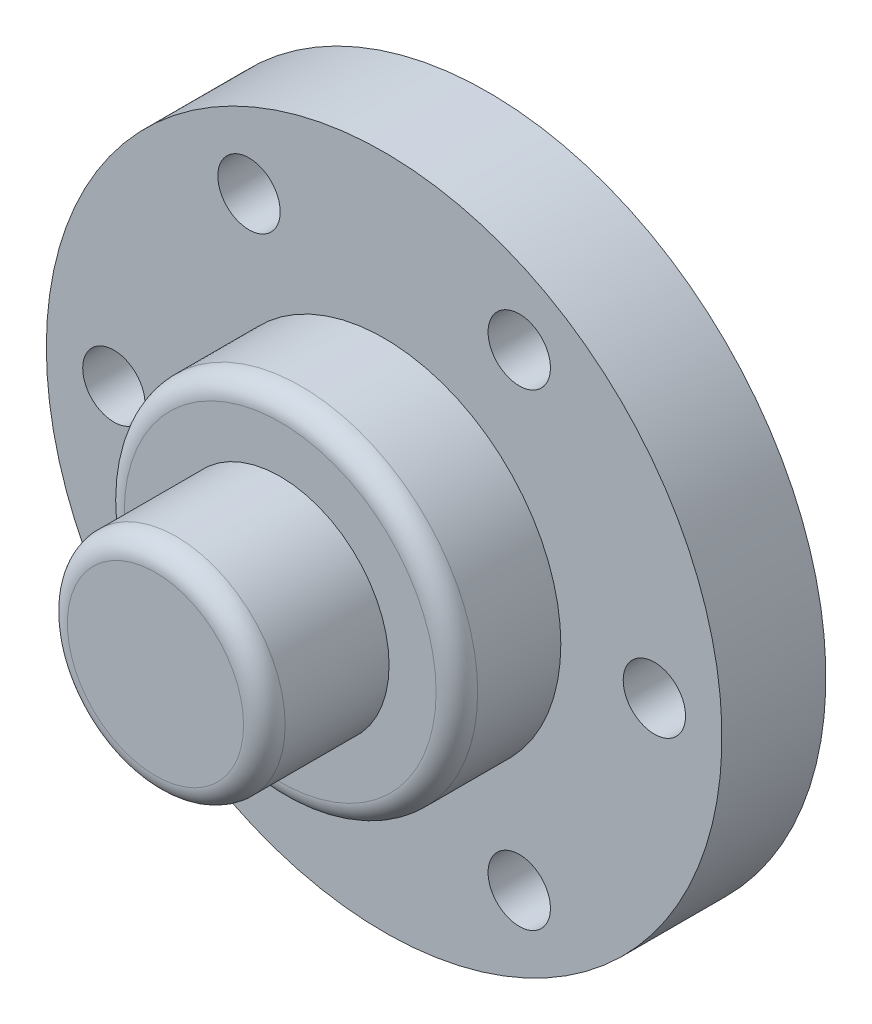
ISO-10303-21;
HEADER;
FILE_DESCRIPTION(('STEP AP214'),'2;1');
FILE_NAME('part.step','',(''),(''),'','','');
FILE_SCHEMA(('AUTOMOTIVE_DESIGN { 1 0 10303 214 1 1 1 1 }'));
ENDSEC;
DATA;
#1=APPLICATION_CONTEXT('core data for automotive mechanical design processes');
#2=APPLICATION_PROTOCOL_DEFINITION('international standard','automotive_design',2000,#1);
#3=PRODUCT_CONTEXT('',#1,'mechanical');
#4=PRODUCT('Part','Part','',(#3));
#5=PRODUCT_RELATED_PRODUCT_CATEGORY('part','',(#4));
#6=PRODUCT_DEFINITION_FORMATION('','',#4);
#7=PRODUCT_DEFINITION_CONTEXT('part definition',#1,'design');
#8=PRODUCT_DEFINITION('design','',#6,#7);
#9=PRODUCT_DEFINITION_SHAPE('','',#8);
#10=(LENGTH_UNIT() NAMED_UNIT(*) SI_UNIT(.MILLI.,.METRE.));
#11=(NAMED_UNIT(*) PLANE_ANGLE_UNIT() SI_UNIT($,.RADIAN.));
#12=(NAMED_UNIT(*) SI_UNIT($,.STERADIAN.) SOLID_ANGLE_UNIT());
#13=UNCERTAINTY_MEASURE_WITH_UNIT(LENGTH_MEASURE(1.E-05),#10,'distance_accuracy_value','');
#14=(GEOMETRIC_REPRESENTATION_CONTEXT(3) GLOBAL_UNCERTAINTY_ASSIGNED_CONTEXT((#13)) GLOBAL_UNIT_ASSIGNED_CONTEXT((#10,
#11,#12)) REPRESENTATION_CONTEXT('',''));
#15=CARTESIAN_POINT('',(0.,0.,0.));
#16=DIRECTION('',(0.,0.,1.));
#17=DIRECTION('',(1.,0.,0.));
#18=AXIS2_PLACEMENT_3D('',#15,#16,#17);
#19=CARTESIAN_POINT('',(0.,0.,10.));
#20=DIRECTION('',(0.,0.,-1.));
#21=DIRECTION('',(-1.,0.,0.));
#22=AXIS2_PLACEMENT_3D('',#19,#20,#21);
#23=CYLINDRICAL_SURFACE('',#22,17.);
#24=CARTESIAN_POINT('',(0.,0.,8.));
#25=DIRECTION('',(0.,0.,1.));
#26=DIRECTION('',(1.,0.,0.));
#27=AXIS2_PLACEMENT_3D('',#24,#25,#26);
#28=CIRCLE('',#27,17.);
#29=CARTESIAN_POINT('',(17.,0.,8.));
#30=VERTEX_POINT('',#29);
#31=EDGE_CURVE('E10',#30,#30,#28,.F.);
#32=ORIENTED_EDGE('',*,*,#31,.T.);
#33=EDGE_LOOP('',(#32));
#34=FACE_BOUND('',#33,.T.);
#35=CARTESIAN_POINT('',(0.,0.,0.));
#36=DIRECTION('',(0.,0.,1.));
#37=DIRECTION('',(1.,0.,0.));
#38=AXIS2_PLACEMENT_3D('',#35,#36,#37);
#39=CIRCLE('',#38,17.);
#40=CARTESIAN_POINT('',(17.,0.,0.));
#41=VERTEX_POINT('',#40);
#42=EDGE_CURVE('E90',#41,#41,#39,.T.);
#43=ORIENTED_EDGE('',*,*,#42,.T.);
#44=EDGE_LOOP('',(#43));
#45=FACE_BOUND('',#44,.T.);
#46=ADVANCED_FACE('F37',(#34,#45),#23,.T.);
#47=CARTESIAN_POINT('',(0.,0.,10.));
#48=DIRECTION('',(0.,0.,1.));
#49=DIRECTION('',(1.,0.,0.));
#50=AXIS2_PLACEMENT_3D('',#47,#48,#49);
#51=PLANE('',#50);
#52=CARTESIAN_POINT('',(0.,0.,10.));
#53=DIRECTION('',(0.,0.,1.));
#54=DIRECTION('',(1.,0.,0.));
#55=AXIS2_PLACEMENT_3D('',#52,#53,#54);
#56=CIRCLE('',#55,15.);
#57=CARTESIAN_POINT('',(15.,0.,10.));
#58=VERTEX_POINT('',#57);
#59=EDGE_CURVE('E46',#58,#58,#56,.T.);
#60=ORIENTED_EDGE('',*,*,#59,.T.);
#61=EDGE_LOOP('',(#60));
#62=FACE_BOUND('',#61,.T.);
#63=CARTESIAN_POINT('',(0.,0.,10.));
#64=DIRECTION('',(0.,0.,1.));
#65=DIRECTION('',(1.,0.,0.));
#66=AXIS2_PLACEMENT_3D('',#63,#64,#65);
#67=CIRCLE('',#66,10.475);
#68=CARTESIAN_POINT('',(10.475,0.,10.));
#69=VERTEX_POINT('',#68);
#70=EDGE_CURVE('E94',#69,#69,#67,.T.);
#71=ORIENTED_EDGE('',*,*,#70,.F.);
#72=EDGE_LOOP('',(#71));
#73=FACE_BOUND('',#72,.T.);
#74=ADVANCED_FACE('F122',(#62,#73),#51,.T.);
#75=CARTESIAN_POINT('',(0.,0.,22.));
#76=DIRECTION('',(0.,0.,-1.));
#77=DIRECTION('',(-1.,0.,0.));
#78=AXIS2_PLACEMENT_3D('',#75,#76,#77);
#79=CYLINDRICAL_SURFACE('',#78,10.475);
#80=CARTESIAN_POINT('',(0.,0.,20.));
#81=DIRECTION('',(0.,0.,1.));
#82=DIRECTION('',(1.,0.,0.));
#83=AXIS2_PLACEMENT_3D('',#80,#81,#82);
#84=CIRCLE('',#83,10.475);
#85=CARTESIAN_POINT('',(10.475,0.,20.));
#86=VERTEX_POINT('',#85);
#87=EDGE_CURVE('E52',#86,#86,#84,.F.);
#88=ORIENTED_EDGE('',*,*,#87,.T.);
#89=EDGE_LOOP('',(#88));
#90=FACE_BOUND('',#89,.T.);
#91=ORIENTED_EDGE('',*,*,#70,.T.);
#92=EDGE_LOOP('',(#91));
#93=FACE_BOUND('',#92,.T.);
#94=ADVANCED_FACE('F108',(#90,#93),#79,.T.);
#95=CARTESIAN_POINT('',(0.,0.,22.));
#96=DIRECTION('',(0.,0.,1.));
#97=DIRECTION('',(1.,0.,0.));
#98=AXIS2_PLACEMENT_3D('',#95,#96,#97);
#99=PLANE('',#98);
#100=CARTESIAN_POINT('',(0.,0.,22.));
#101=DIRECTION('',(0.,0.,1.));
#102=DIRECTION('',(1.,0.,0.));
#103=AXIS2_PLACEMENT_3D('',#100,#101,#102);
#104=CIRCLE('',#103,8.475);
#105=CARTESIAN_POINT('',(8.475,0.,22.));
#106=VERTEX_POINT('',#105);
#107=EDGE_CURVE('E98',#106,#106,#104,.T.);
#108=ORIENTED_EDGE('',*,*,#107,.T.);
#109=EDGE_LOOP('',(#108));
#110=FACE_BOUND('',#109,.T.);
#111=ADVANCED_FACE('F114',(#110),#99,.T.);
#112=CARTESIAN_POINT('',(0.,0.,20.));
#113=DIRECTION('',(0.,0.,1.));
#114=DIRECTION('',(1.,0.,0.));
#115=AXIS2_PLACEMENT_3D('',#112,#113,#114);
#116=TOROIDAL_SURFACE('',#115,8.475,2.);
#117=ORIENTED_EDGE('',*,*,#87,.F.);
#118=EDGE_LOOP('',(#117));
#119=FACE_BOUND('',#118,.T.);
#120=ORIENTED_EDGE('',*,*,#107,.F.);
#121=EDGE_LOOP('',(#120));
#122=FACE_BOUND('',#121,.T.);
#123=ADVANCED_FACE('F111',(#119,#122),#116,.T.);
#124=CARTESIAN_POINT('',(0.,0.,8.));
#125=DIRECTION('',(0.,0.,1.));
#126=DIRECTION('',(1.,0.,0.));
#127=AXIS2_PLACEMENT_3D('',#124,#125,#126);
#128=TOROIDAL_SURFACE('',#127,15.,2.);
#129=ORIENTED_EDGE('',*,*,#31,.F.);
#130=EDGE_LOOP('',(#129));
#131=FACE_BOUND('',#130,.T.);
#132=ORIENTED_EDGE('',*,*,#59,.F.);
#133=EDGE_LOOP('',(#132));
#134=FACE_BOUND('',#133,.T.);
#135=ADVANCED_FACE('F39',(#131,#134),#128,.T.);
#136=CARTESIAN_POINT('',(0.,0.,-10.));
#137=DIRECTION('',(0.,0.,1.));
#138=DIRECTION('',(1.,0.,0.));
#139=AXIS2_PLACEMENT_3D('',#136,#137,#138);
#140=CYLINDRICAL_SURFACE('',#139,32.5);
#141=CARTESIAN_POINT('',(0.,0.,-10.));
#142=DIRECTION('',(0.,0.,-1.));
#143=DIRECTION('',(-1.,0.,0.));
#144=AXIS2_PLACEMENT_3D('',#141,#142,#143);
#145=CIRCLE('',#144,32.5);
#146=CARTESIAN_POINT('',(-32.5,0.,-10.));
#147=VERTEX_POINT('',#146);
#148=EDGE_CURVE('E84',#147,#147,#145,.T.);
#149=ORIENTED_EDGE('',*,*,#148,.F.);
#150=EDGE_LOOP('',(#149));
#151=FACE_BOUND('',#150,.T.);
#152=CARTESIAN_POINT('',(0.,0.,0.));
#153=DIRECTION('',(0.,0.,-1.));
#154=DIRECTION('',(-1.,0.,0.));
#155=AXIS2_PLACEMENT_3D('',#152,#153,#154);
#156=CIRCLE('',#155,32.5);
#157=CARTESIAN_POINT('',(-32.5,0.,0.));
#158=VERTEX_POINT('',#157);
#159=EDGE_CURVE('E79',#158,#158,#156,.T.);
#160=ORIENTED_EDGE('',*,*,#159,.T.);
#161=EDGE_LOOP('',(#160));
#162=FACE_BOUND('',#161,.T.);
#163=ADVANCED_FACE('F148',(#151,#162),#140,.T.);
#164=CARTESIAN_POINT('',(0.,0.,-10.));
#165=DIRECTION('',(0.,0.,-1.));
#166=DIRECTION('',(-1.,0.,0.));
#167=AXIS2_PLACEMENT_3D('',#164,#165,#166);
#168=PLANE('',#167);
#169=CARTESIAN_POINT('',(-26.,0.,-10.));
#170=DIRECTION('',(0.,0.,-1.));
#171=DIRECTION('',(-1.,0.,0.));
#172=AXIS2_PLACEMENT_3D('',#169,#170,#171);
#173=CIRCLE('',#172,2.99999999999999);
#174=CARTESIAN_POINT('',(-29.,0.,-10.));
#175=VERTEX_POINT('',#174);
#176=EDGE_CURVE('E61',#175,#175,#173,.T.);
#177=ORIENTED_EDGE('',*,*,#176,.F.);
#178=EDGE_LOOP('',(#177));
#179=FACE_BOUND('',#178,.T.);
#180=CARTESIAN_POINT('',(-13.0000000000003,22.5166604983953,-10.));
#181=DIRECTION('',(0.,0.,-1.));
#182=DIRECTION('',(-1.,0.,0.));
#183=AXIS2_PLACEMENT_3D('',#180,#181,#182);
#184=CIRCLE('',#183,2.99999999999999);
#185=CARTESIAN_POINT('',(-16.0000000000003,22.5166604983953,-10.));
#186=VERTEX_POINT('',#185);
#187=EDGE_CURVE('E274',#186,#186,#184,.T.);
#188=ORIENTED_EDGE('',*,*,#187,.F.);
#189=EDGE_LOOP('',(#188));
#190=FACE_BOUND('',#189,.T.);
#191=CARTESIAN_POINT('',(12.9999999999998,22.5166604983955,-10.));
#192=DIRECTION('',(0.,0.,-1.));
#193=DIRECTION('',(-1.,0.,0.));
#194=AXIS2_PLACEMENT_3D('',#191,#192,#193);
#195=CIRCLE('',#194,2.99999999999999);
#196=CARTESIAN_POINT('',(9.99999999999979,22.5166604983955,-10.));
#197=VERTEX_POINT('',#196);
#198=EDGE_CURVE('E277',#197,#197,#195,.T.);
#199=ORIENTED_EDGE('',*,*,#198,.F.);
#200=EDGE_LOOP('',(#199));
#201=FACE_BOUND('',#200,.T.);
#202=CARTESIAN_POINT('',(26.,1.81557029619843E-13,-10.));
#203=DIRECTION('',(0.,0.,-1.));
#204=DIRECTION('',(-1.,0.,0.));
#205=AXIS2_PLACEMENT_3D('',#202,#203,#204);
#206=CIRCLE('',#205,2.99999999999999);
#207=CARTESIAN_POINT('',(23.,1.81557029619843E-13,-10.));
#208=VERTEX_POINT('',#207);
#209=EDGE_CURVE('E282',#208,#208,#206,.T.);
#210=ORIENTED_EDGE('',*,*,#209,.F.);
#211=EDGE_LOOP('',(#210));
#212=FACE_BOUND('',#211,.T.);
#213=CARTESIAN_POINT('',(13.0000000000001,-22.5166604983954,-10.));
#214=DIRECTION('',(0.,0.,-1.));
#215=DIRECTION('',(-1.,0.,0.));
#216=AXIS2_PLACEMENT_3D('',#213,#214,#215);
#217=CIRCLE('',#216,2.99999999999999);
#218=CARTESIAN_POINT('',(10.0000000000001,-22.5166604983954,-10.));
#219=VERTEX_POINT('',#218);
#220=EDGE_CURVE('E271',#219,#219,#217,.T.);
#221=ORIENTED_EDGE('',*,*,#220,.F.);
#222=EDGE_LOOP('',(#221));
#223=FACE_BOUND('',#222,.T.);
#224=CARTESIAN_POINT('',(-12.9999999999999,-22.5166604983954,-10.));
#225=DIRECTION('',(0.,0.,-1.));
#226=DIRECTION('',(-1.,0.,0.));
#227=AXIS2_PLACEMENT_3D('',#224,#225,#226);
#228=CIRCLE('',#227,2.99999999999999);
#229=CARTESIAN_POINT('',(-15.9999999999999,-22.5166604983954,-10.));
#230=VERTEX_POINT('',#229);
#231=EDGE_CURVE('E267',#230,#230,#228,.T.);
#232=ORIENTED_EDGE('',*,*,#231,.F.);
#233=EDGE_LOOP('',(#232));
#234=FACE_BOUND('',#233,.T.);
#235=ORIENTED_EDGE('',*,*,#148,.T.);
#236=EDGE_LOOP('',(#235));
#237=FACE_BOUND('',#236,.T.);
#238=ADVANCED_FACE('F139',(#179,#190,#201,#212,#223,#234,#237),#168,.T.);
#239=CARTESIAN_POINT('',(0.,0.,0.));
#240=DIRECTION('',(0.,0.,-1.));
#241=DIRECTION('',(-1.,0.,0.));
#242=AXIS2_PLACEMENT_3D('',#239,#240,#241);
#243=PLANE('',#242);
#244=CARTESIAN_POINT('',(-26.,0.,0.));
#245=DIRECTION('',(0.,0.,-1.));
#246=DIRECTION('',(-1.,0.,0.));
#247=AXIS2_PLACEMENT_3D('',#244,#245,#246);
#248=CIRCLE('',#247,2.99999999999999);
#249=CARTESIAN_POINT('',(-29.,0.,0.));
#250=VERTEX_POINT('',#249);
#251=EDGE_CURVE('E41',#250,#250,#248,.T.);
#252=ORIENTED_EDGE('',*,*,#251,.T.);
#253=EDGE_LOOP('',(#252));
#254=FACE_BOUND('',#253,.T.);
#255=CARTESIAN_POINT('',(-13.0000000000003,22.5166604983953,0.));
#256=DIRECTION('',(0.,0.,-1.));
#257=DIRECTION('',(-1.,0.,0.));
#258=AXIS2_PLACEMENT_3D('',#255,#256,#257);
#259=CIRCLE('',#258,2.99999999999999);
#260=CARTESIAN_POINT('',(-16.0000000000003,22.5166604983953,0.));
#261=VERTEX_POINT('',#260);
#262=EDGE_CURVE('E72',#261,#261,#259,.T.);
#263=ORIENTED_EDGE('',*,*,#262,.T.);
#264=EDGE_LOOP('',(#263));
#265=FACE_BOUND('',#264,.T.);
#266=CARTESIAN_POINT('',(12.9999999999998,22.5166604983955,0.));
#267=DIRECTION('',(0.,0.,-1.));
#268=DIRECTION('',(-1.,0.,0.));
#269=AXIS2_PLACEMENT_3D('',#266,#267,#268);
#270=CIRCLE('',#269,2.99999999999999);
#271=CARTESIAN_POINT('',(9.99999999999979,22.5166604983955,0.));
#272=VERTEX_POINT('',#271);
#273=EDGE_CURVE('E69',#272,#272,#270,.T.);
#274=ORIENTED_EDGE('',*,*,#273,.T.);
#275=EDGE_LOOP('',(#274));
#276=FACE_BOUND('',#275,.T.);
#277=CARTESIAN_POINT('',(26.,1.81557029619843E-13,0.));
#278=DIRECTION('',(0.,0.,-1.));
#279=DIRECTION('',(-1.,0.,0.));
#280=AXIS2_PLACEMENT_3D('',#277,#278,#279);
#281=CIRCLE('',#280,2.99999999999999);
#282=CARTESIAN_POINT('',(23.,1.81557029619843E-13,0.));
#283=VERTEX_POINT('',#282);
#284=EDGE_CURVE('E65',#283,#283,#281,.T.);
#285=ORIENTED_EDGE('',*,*,#284,.T.);
#286=EDGE_LOOP('',(#285));
#287=FACE_BOUND('',#286,.T.);
#288=CARTESIAN_POINT('',(13.0000000000001,-22.5166604983954,0.));
#289=DIRECTION('',(0.,0.,-1.));
#290=DIRECTION('',(-1.,0.,0.));
#291=AXIS2_PLACEMENT_3D('',#288,#289,#290);
#292=CIRCLE('',#291,2.99999999999999);
#293=CARTESIAN_POINT('',(10.0000000000001,-22.5166604983954,0.));
#294=VERTEX_POINT('',#293);
#295=EDGE_CURVE('E60',#294,#294,#292,.T.);
#296=ORIENTED_EDGE('',*,*,#295,.T.);
#297=EDGE_LOOP('',(#296));
#298=FACE_BOUND('',#297,.T.);
#299=CARTESIAN_POINT('',(-12.9999999999999,-22.5166604983954,0.));
#300=DIRECTION('',(0.,0.,-1.));
#301=DIRECTION('',(-1.,0.,0.));
#302=AXIS2_PLACEMENT_3D('',#299,#300,#301);
#303=CIRCLE('',#302,2.99999999999999);
#304=CARTESIAN_POINT('',(-15.9999999999999,-22.5166604983954,0.));
#305=VERTEX_POINT('',#304);
#306=EDGE_CURVE('E56',#305,#305,#303,.T.);
#307=ORIENTED_EDGE('',*,*,#306,.T.);
#308=EDGE_LOOP('',(#307));
#309=FACE_BOUND('',#308,.T.);
#310=ORIENTED_EDGE('',*,*,#42,.F.);
#311=EDGE_LOOP('',(#310));
#312=FACE_BOUND('',#311,.T.);
#313=ORIENTED_EDGE('',*,*,#159,.F.);
#314=EDGE_LOOP('',(#313));
#315=FACE_BOUND('',#314,.T.);
#316=ADVANCED_FACE('F135',(#254,#265,#276,#287,#298,#309,#312,#315),#243,.F.);
#317=CARTESIAN_POINT('',(-12.9999999999999,-22.5166604983954,22.));
#318=DIRECTION('',(0.,0.,-1.));
#319=DIRECTION('',(-1.,0.,0.));
#320=AXIS2_PLACEMENT_3D('',#317,#318,#319);
#321=CYLINDRICAL_SURFACE('',#320,2.99999999999999);
#322=ORIENTED_EDGE('',*,*,#231,.T.);
#323=EDGE_LOOP('',(#322));
#324=FACE_BOUND('',#323,.T.);
#325=ORIENTED_EDGE('',*,*,#306,.F.);
#326=EDGE_LOOP('',(#325));
#327=FACE_BOUND('',#326,.T.);
#328=ADVANCED_FACE('F138',(#324,#327),#321,.F.);
#329=CARTESIAN_POINT('',(13.0000000000001,-22.5166604983954,22.));
#330=DIRECTION('',(0.,0.,-1.));
#331=DIRECTION('',(-1.,0.,0.));
#332=AXIS2_PLACEMENT_3D('',#329,#330,#331);
#333=CYLINDRICAL_SURFACE('',#332,2.99999999999999);
#334=ORIENTED_EDGE('',*,*,#220,.T.);
#335=EDGE_LOOP('',(#334));
#336=FACE_BOUND('',#335,.T.);
#337=ORIENTED_EDGE('',*,*,#295,.F.);
#338=EDGE_LOOP('',(#337));
#339=FACE_BOUND('',#338,.T.);
#340=ADVANCED_FACE('F145',(#336,#339),#333,.F.);
#341=CARTESIAN_POINT('',(26.,1.81557029619843E-13,22.));
#342=DIRECTION('',(0.,0.,-1.));
#343=DIRECTION('',(-1.,0.,0.));
#344=AXIS2_PLACEMENT_3D('',#341,#342,#343);
#345=CYLINDRICAL_SURFACE('',#344,2.99999999999999);
#346=ORIENTED_EDGE('',*,*,#209,.T.);
#347=EDGE_LOOP('',(#346));
#348=FACE_BOUND('',#347,.T.);
#349=ORIENTED_EDGE('',*,*,#284,.F.);
#350=EDGE_LOOP('',(#349));
#351=FACE_BOUND('',#350,.T.);
#352=ADVANCED_FACE('F220',(#348,#351),#345,.F.);
#353=CARTESIAN_POINT('',(12.9999999999998,22.5166604983955,22.));
#354=DIRECTION('',(0.,0.,-1.));
#355=DIRECTION('',(-1.,0.,0.));
#356=AXIS2_PLACEMENT_3D('',#353,#354,#355);
#357=CYLINDRICAL_SURFACE('',#356,2.99999999999999);
#358=ORIENTED_EDGE('',*,*,#198,.T.);
#359=EDGE_LOOP('',(#358));
#360=FACE_BOUND('',#359,.T.);
#361=ORIENTED_EDGE('',*,*,#273,.F.);
#362=EDGE_LOOP('',(#361));
#363=FACE_BOUND('',#362,.T.);
#364=ADVANCED_FACE('F229',(#360,#363),#357,.F.);
#365=CARTESIAN_POINT('',(-13.0000000000003,22.5166604983953,22.));
#366=DIRECTION('',(0.,0.,-1.));
#367=DIRECTION('',(-1.,0.,0.));
#368=AXIS2_PLACEMENT_3D('',#365,#366,#367);
#369=CYLINDRICAL_SURFACE('',#368,2.99999999999999);
#370=ORIENTED_EDGE('',*,*,#187,.T.);
#371=EDGE_LOOP('',(#370));
#372=FACE_BOUND('',#371,.T.);
#373=ORIENTED_EDGE('',*,*,#262,.F.);
#374=EDGE_LOOP('',(#373));
#375=FACE_BOUND('',#374,.T.);
#376=ADVANCED_FACE('F238',(#372,#375),#369,.F.);
#377=CARTESIAN_POINT('',(-26.,0.,22.));
#378=DIRECTION('',(0.,0.,-1.));
#379=DIRECTION('',(-1.,0.,0.));
#380=AXIS2_PLACEMENT_3D('',#377,#378,#379);
#381=CYLINDRICAL_SURFACE('',#380,2.99999999999999);
#382=ORIENTED_EDGE('',*,*,#176,.T.);
#383=EDGE_LOOP('',(#382));
#384=FACE_BOUND('',#383,.T.);
#385=ORIENTED_EDGE('',*,*,#251,.F.);
#386=EDGE_LOOP('',(#385));
#387=FACE_BOUND('',#386,.T.);
#388=ADVANCED_FACE('F246',(#384,#387),#381,.F.);
#389=CLOSED_SHELL('',(#46,#74,#94,#111,#123,#135,#163,#238,#316,#328,#340,#352,#364,#376,#388));
#390=MANIFOLD_SOLID_BREP('B2',#389);
#391=ADVANCED_BREP_SHAPE_REPRESENTATION('',(#18,#390),#14);
#392=SHAPE_DEFINITION_REPRESENTATION(#9,#391);
ENDSEC;
END-ISO-10303-21;
